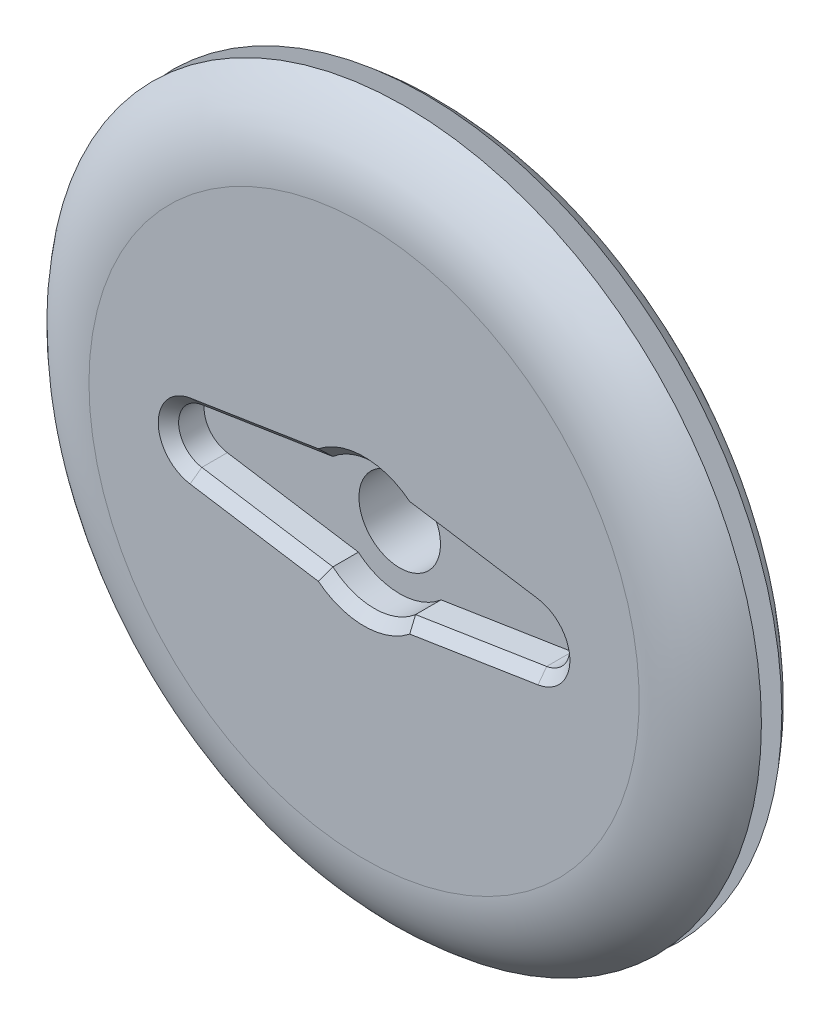
ISO-10303-21;
HEADER;
FILE_DESCRIPTION(('STEP AP214'),'2;1');
FILE_NAME('part.step','',(''),(''),'','','');
FILE_SCHEMA(('AUTOMOTIVE_DESIGN { 1 0 10303 214 1 1 1 1 }'));
ENDSEC;
DATA;
#1=APPLICATION_CONTEXT('core data for automotive mechanical design processes');
#2=APPLICATION_PROTOCOL_DEFINITION('international standard','automotive_design',2000,#1);
#3=PRODUCT_CONTEXT('',#1,'mechanical');
#4=PRODUCT('Part','Part','',(#3));
#5=PRODUCT_RELATED_PRODUCT_CATEGORY('part','',(#4));
#6=PRODUCT_DEFINITION_FORMATION('','',#4);
#7=PRODUCT_DEFINITION_CONTEXT('part definition',#1,'design');
#8=PRODUCT_DEFINITION('design','',#6,#7);
#9=PRODUCT_DEFINITION_SHAPE('','',#8);
#10=(LENGTH_UNIT() NAMED_UNIT(*) SI_UNIT(.MILLI.,.METRE.));
#11=(NAMED_UNIT(*) PLANE_ANGLE_UNIT() SI_UNIT($,.RADIAN.));
#12=(NAMED_UNIT(*) SI_UNIT($,.STERADIAN.) SOLID_ANGLE_UNIT());
#13=UNCERTAINTY_MEASURE_WITH_UNIT(LENGTH_MEASURE(1.E-05),#10,'distance_accuracy_value','');
#14=(GEOMETRIC_REPRESENTATION_CONTEXT(3) GLOBAL_UNCERTAINTY_ASSIGNED_CONTEXT((#13)) GLOBAL_UNIT_ASSIGNED_CONTEXT((#10,
#11,#12)) REPRESENTATION_CONTEXT('',''));
#15=CARTESIAN_POINT('',(0.,0.,0.));
#16=DIRECTION('',(0.,0.,1.));
#17=DIRECTION('',(1.,0.,0.));
#18=AXIS2_PLACEMENT_3D('',#15,#16,#17);
#19=CARTESIAN_POINT('',(0.,0.,-8.001));
#20=DIRECTION('',(0.,0.,1.));
#21=DIRECTION('',(1.,0.,0.));
#22=AXIS2_PLACEMENT_3D('',#19,#20,#21);
#23=CYLINDRICAL_SURFACE('',#22,4.);
#24=CARTESIAN_POINT('',(0.,0.,-8.));
#25=DIRECTION('',(0.,0.,1.));
#26=DIRECTION('',(1.,0.,0.));
#27=AXIS2_PLACEMENT_3D('',#24,#25,#26);
#28=CIRCLE('',#27,4.);
#29=CARTESIAN_POINT('',(4.,0.,-8.));
#30=VERTEX_POINT('',#29);
#31=EDGE_CURVE('E148',#30,#30,#28,.F.);
#32=ORIENTED_EDGE('',*,*,#31,.T.);
#33=EDGE_LOOP('',(#32));
#34=FACE_BOUND('',#33,.T.);
#35=CARTESIAN_POINT('',(0.,0.,-1.5));
#36=DIRECTION('',(0.,0.,1.));
#37=DIRECTION('',(1.,0.,0.));
#38=AXIS2_PLACEMENT_3D('',#35,#36,#37);
#39=CIRCLE('',#38,4.);
#40=CARTESIAN_POINT('',(4.,0.,-1.5));
#41=VERTEX_POINT('',#40);
#42=EDGE_CURVE('E56',#41,#41,#39,.F.);
#43=ORIENTED_EDGE('',*,*,#42,.F.);
#44=EDGE_LOOP('',(#43));
#45=FACE_BOUND('',#44,.T.);
#46=ADVANCED_FACE('F52',(#34,#45),#23,.F.);
#47=CARTESIAN_POINT('',(0.,0.,-2.));
#48=DIRECTION('',(0.,0.,-1.));
#49=DIRECTION('',(-1.,0.,0.));
#50=AXIS2_PLACEMENT_3D('',#47,#48,#49);
#51=PLANE('',#50);
#52=CARTESIAN_POINT('',(0.,0.,-2.));
#53=DIRECTION('',(0.,0.,-1.));
#54=DIRECTION('',(-1.,0.,0.));
#55=AXIS2_PLACEMENT_3D('',#52,#53,#54);
#56=CIRCLE('',#55,25.);
#57=CARTESIAN_POINT('',(-25.,0.,-2.));
#58=VERTEX_POINT('',#57);
#59=EDGE_CURVE('E210',#58,#58,#56,.T.);
#60=ORIENTED_EDGE('',*,*,#59,.F.);
#61=EDGE_LOOP('',(#60));
#62=FACE_BOUND('',#61,.T.);
#63=CARTESIAN_POINT('',(0.,0.,-2.));
#64=DIRECTION('',(0.,0.,-1.));
#65=DIRECTION('',(-1.,0.,0.));
#66=AXIS2_PLACEMENT_3D('',#63,#64,#65);
#67=CIRCLE('',#66,35.);
#68=CARTESIAN_POINT('',(-35.,0.,-2.));
#69=VERTEX_POINT('',#68);
#70=EDGE_CURVE('E211',#69,#69,#67,.T.);
#71=ORIENTED_EDGE('',*,*,#70,.T.);
#72=EDGE_LOOP('',(#71));
#73=FACE_BOUND('',#72,.T.);
#74=ADVANCED_FACE('F372',(#62,#73),#51,.T.);
#75=CARTESIAN_POINT('',(0.,0.,2.));
#76=DIRECTION('',(0.,0.,-1.));
#77=DIRECTION('',(-1.,0.,0.));
#78=AXIS2_PLACEMENT_3D('',#75,#76,#77);
#79=PLANE('',#78);
#80=CARTESIAN_POINT('',(16.5,0.,2.));
#81=DIRECTION('',(0.,0.,-1.));
#82=DIRECTION('',(-1.,0.,0.));
#83=AXIS2_PLACEMENT_3D('',#80,#81,#82);
#84=CIRCLE('',#83,3.70000000000002);
#85=CARTESIAN_POINT('',(17.0744090126528,3.65514080251136,2.));
#86=VERTEX_POINT('',#85);
#87=CARTESIAN_POINT('',(17.0744090126528,-3.65514080251136,2.));
#88=VERTEX_POINT('',#87);
#89=EDGE_CURVE('E232',#86,#88,#84,.T.);
#90=ORIENTED_EDGE('',*,*,#89,.T.);
#91=DIRECTION('',(-0.987875892570632,-0.155245679095352,0.));
#92=VECTOR('',#91,1.);
#93=CARTESIAN_POINT('',(0.972079157136123,-6.18563795527826,2.));
#94=LINE('',#93,#92);
#95=CARTESIAN_POINT('',(4.48327208773925,-5.63385049387171,2.));
#96=VERTEX_POINT('',#95);
#97=EDGE_CURVE('E240',#88,#96,#94,.T.);
#98=ORIENTED_EDGE('',*,*,#97,.T.);
#99=CARTESIAN_POINT('',(0.,0.,2.));
#100=DIRECTION('',(0.,0.,-1.));
#101=DIRECTION('',(-1.,0.,0.));
#102=AXIS2_PLACEMENT_3D('',#99,#100,#101);
#103=CIRCLE('',#102,7.20000000000003);
#104=CARTESIAN_POINT('',(-4.48327208773927,-5.63385049387169,2.));
#105=VERTEX_POINT('',#104);
#106=EDGE_CURVE('E235',#96,#105,#103,.T.);
#107=ORIENTED_EDGE('',*,*,#106,.T.);
#108=DIRECTION('',(-0.987875892570632,0.155245679095352,0.));
#109=VECTOR('',#108,1.);
#110=CARTESIAN_POINT('',(-0.972079157136121,-6.18563795527825,2.));
#111=LINE('',#110,#109);
#112=CARTESIAN_POINT('',(-17.0744090126528,-3.65514080251135,2.));
#113=VERTEX_POINT('',#112);
#114=EDGE_CURVE('E226',#105,#113,#111,.T.);
#115=ORIENTED_EDGE('',*,*,#114,.T.);
#116=CARTESIAN_POINT('',(-16.5,0.,2.));
#117=DIRECTION('',(0.,0.,-1.));
#118=DIRECTION('',(-1.,0.,0.));
#119=AXIS2_PLACEMENT_3D('',#116,#117,#118);
#120=CIRCLE('',#119,3.70000000000001);
#121=CARTESIAN_POINT('',(-17.0744090126528,3.65514080251135,2.));
#122=VERTEX_POINT('',#121);
#123=EDGE_CURVE('E228',#113,#122,#120,.T.);
#124=ORIENTED_EDGE('',*,*,#123,.T.);
#125=DIRECTION('',(0.987875892570632,0.155245679095352,0.));
#126=VECTOR('',#125,1.);
#127=CARTESIAN_POINT('',(-0.972079157136122,6.18563795527825,2.));
#128=LINE('',#127,#126);
#129=CARTESIAN_POINT('',(-4.48327208773924,5.6338504938717,2.));
#130=VERTEX_POINT('',#129);
#131=EDGE_CURVE('E224',#122,#130,#128,.T.);
#132=ORIENTED_EDGE('',*,*,#131,.T.);
#133=CARTESIAN_POINT('',(0.,0.,2.));
#134=DIRECTION('',(0.,0.,-1.));
#135=DIRECTION('',(-1.,0.,0.));
#136=AXIS2_PLACEMENT_3D('',#133,#134,#135);
#137=CIRCLE('',#136,7.20000000000003);
#138=CARTESIAN_POINT('',(4.48327208773922,5.63385049387171,2.));
#139=VERTEX_POINT('',#138);
#140=EDGE_CURVE('E225',#130,#139,#137,.T.);
#141=ORIENTED_EDGE('',*,*,#140,.T.);
#142=DIRECTION('',(0.987875892570632,-0.155245679095352,0.));
#143=VECTOR('',#142,1.);
#144=CARTESIAN_POINT('',(0.972079157136123,6.18563795527826,2.));
#145=LINE('',#144,#143);
#146=EDGE_CURVE('E229',#139,#86,#145,.T.);
#147=ORIENTED_EDGE('',*,*,#146,.T.);
#148=EDGE_LOOP('',(#90,#98,#107,#115,#124,#132,#141,#147));
#149=FACE_BOUND('',#148,.T.);
#150=CARTESIAN_POINT('',(0.,0.,2.));
#151=DIRECTION('',(0.,0.,-1.));
#152=DIRECTION('',(-1.,0.,0.));
#153=AXIS2_PLACEMENT_3D('',#150,#151,#152);
#154=CIRCLE('',#153,27.);
#155=CARTESIAN_POINT('',(-27.,0.,2.));
#156=VERTEX_POINT('',#155);
#157=EDGE_CURVE('E219',#156,#156,#154,.F.);
#158=ORIENTED_EDGE('',*,*,#157,.T.);
#159=EDGE_LOOP('',(#158));
#160=FACE_BOUND('',#159,.T.);
#161=ADVANCED_FACE('F355',(#149,#160),#79,.F.);
#162=CARTESIAN_POINT('',(0.,0.,-8.));
#163=DIRECTION('',(0.,0.,1.));
#164=DIRECTION('',(1.,0.,0.));
#165=AXIS2_PLACEMENT_3D('',#162,#163,#164);
#166=TOROIDAL_SURFACE('',#165,27.,10.);
#167=ORIENTED_EDGE('',*,*,#157,.F.);
#168=EDGE_LOOP('',(#167));
#169=FACE_BOUND('',#168,.T.);
#170=ORIENTED_EDGE('',*,*,#70,.F.);
#171=EDGE_LOOP('',(#170));
#172=FACE_BOUND('',#171,.T.);
#173=ADVANCED_FACE('F384',(#169,#172),#166,.T.);
#174=CARTESIAN_POINT('',(0.,0.,-4.));
#175=DIRECTION('',(0.,0.,1.));
#176=DIRECTION('',(1.,0.,0.));
#177=AXIS2_PLACEMENT_3D('',#174,#175,#176);
#178=CYLINDRICAL_SURFACE('',#177,25.);
#179=CARTESIAN_POINT('',(0.,0.,-4.));
#180=DIRECTION('',(0.,0.,-1.));
#181=DIRECTION('',(-1.,0.,0.));
#182=AXIS2_PLACEMENT_3D('',#179,#180,#181);
#183=CIRCLE('',#182,25.);
#184=CARTESIAN_POINT('',(-25.,0.,-4.));
#185=VERTEX_POINT('',#184);
#186=EDGE_CURVE('E206',#185,#185,#183,.T.);
#187=ORIENTED_EDGE('',*,*,#186,.F.);
#188=EDGE_LOOP('',(#187));
#189=FACE_BOUND('',#188,.T.);
#190=ORIENTED_EDGE('',*,*,#59,.T.);
#191=EDGE_LOOP('',(#190));
#192=FACE_BOUND('',#191,.T.);
#193=ADVANCED_FACE('F395',(#189,#192),#178,.T.);
#194=CARTESIAN_POINT('',(0.,0.,-4.));
#195=DIRECTION('',(0.,0.,1.));
#196=DIRECTION('',(-1.,0.,0.));
#197=AXIS2_PLACEMENT_3D('',#194,#195,#196);
#198=PLANE('',#197);
#199=ORIENTED_EDGE('',*,*,#186,.T.);
#200=EDGE_LOOP('',(#199));
#201=FACE_BOUND('',#200,.T.);
#202=CARTESIAN_POINT('',(0.,0.,-4.));
#203=DIRECTION('',(0.,0.,-1.));
#204=DIRECTION('',(-1.,0.,0.));
#205=AXIS2_PLACEMENT_3D('',#202,#203,#204);
#206=CIRCLE('',#205,35.);
#207=CARTESIAN_POINT('',(-35.,0.,-4.));
#208=VERTEX_POINT('',#207);
#209=EDGE_CURVE('E203',#208,#208,#206,.T.);
#210=ORIENTED_EDGE('',*,*,#209,.F.);
#211=EDGE_LOOP('',(#210));
#212=FACE_BOUND('',#211,.T.);
#213=ADVANCED_FACE('F397',(#201,#212),#198,.T.);
#214=CARTESIAN_POINT('',(0.,0.,-8.));
#215=DIRECTION('',(0.,0.,1.));
#216=DIRECTION('',(-1.,0.,0.));
#217=AXIS2_PLACEMENT_3D('',#214,#215,#216);
#218=PLANE('',#217);
#219=ORIENTED_EDGE('',*,*,#31,.F.);
#220=EDGE_LOOP('',(#219));
#221=FACE_BOUND('',#220,.T.);
#222=CARTESIAN_POINT('',(0.,0.,-8.));
#223=DIRECTION('',(0.,0.,-1.));
#224=DIRECTION('',(-1.,0.,0.));
#225=AXIS2_PLACEMENT_3D('',#222,#223,#224);
#226=CIRCLE('',#225,27.);
#227=CARTESIAN_POINT('',(-27.,0.,-8.));
#228=VERTEX_POINT('',#227);
#229=EDGE_CURVE('E205',#228,#228,#226,.F.);
#230=ORIENTED_EDGE('',*,*,#229,.F.);
#231=EDGE_LOOP('',(#230));
#232=FACE_BOUND('',#231,.T.);
#233=ADVANCED_FACE('F401',(#221,#232),#218,.F.);
#234=CARTESIAN_POINT('',(0.,0.,2.));
#235=DIRECTION('',(0.,0.,-1.));
#236=DIRECTION('',(1.,0.,0.));
#237=AXIS2_PLACEMENT_3D('',#234,#235,#236);
#238=TOROIDAL_SURFACE('',#237,27.,10.);
#239=ORIENTED_EDGE('',*,*,#229,.T.);
#240=EDGE_LOOP('',(#239));
#241=FACE_BOUND('',#240,.T.);
#242=ORIENTED_EDGE('',*,*,#209,.T.);
#243=EDGE_LOOP('',(#242));
#244=FACE_BOUND('',#243,.T.);
#245=ADVANCED_FACE('F396',(#241,#244),#238,.T.);
#246=CARTESIAN_POINT('',(-4.05671289075597,4.68861179049559,-40.3524472615974));
#247=DIRECTION('',(-0.155245679095352,0.987875892570632,0.));
#248=DIRECTION('',(-0.987875892570632,-0.155245679095352,0.));
#249=AXIS2_PLACEMENT_3D('',#246,#247,#248);
#250=PLANE('',#249);
#251=DIRECTION('',(0.,0.,1.));
#252=VECTOR('',#251,1.);
#253=CARTESIAN_POINT('',(-4.05671289075597,4.68861179049559,-40.3524472615974));
#254=LINE('',#253,#252);
#255=CARTESIAN_POINT('',(-4.05671289075597,4.6886117904956,-1.5));
#256=VERTEX_POINT('',#255);
#257=CARTESIAN_POINT('',(-4.05671289075597,4.68861179049559,1.));
#258=VERTEX_POINT('',#257);
#259=EDGE_CURVE('E145',#256,#258,#254,.T.);
#260=ORIENTED_EDGE('',*,*,#259,.T.);
#261=DIRECTION('',(-0.987875892570632,-0.155245679095352,0.));
#262=VECTOR('',#261,1.);
#263=CARTESIAN_POINT('',(-4.05671289075597,4.68861179049559,1.));
#264=LINE('',#263,#262);
#265=CARTESIAN_POINT('',(-16.9191633335575,2.66726490994071,1.));
#266=VERTEX_POINT('',#265);
#267=EDGE_CURVE('E12',#258,#266,#264,.T.);
#268=ORIENTED_EDGE('',*,*,#267,.T.);
#269=DIRECTION('',(0.,0.,1.));
#270=VECTOR('',#269,1.);
#271=CARTESIAN_POINT('',(-16.9191633335575,2.66726490994071,-40.3524472615974));
#272=LINE('',#271,#270);
#273=CARTESIAN_POINT('',(-16.9191633335575,2.66726490994071,-1.5));
#274=VERTEX_POINT('',#273);
#275=EDGE_CURVE('E152',#274,#266,#272,.T.);
#276=ORIENTED_EDGE('',*,*,#275,.F.);
#277=DIRECTION('',(-0.987875892570632,-0.155245679095352,0.));
#278=VECTOR('',#277,1.);
#279=CARTESIAN_POINT('',(-4.05671289075597,4.6886117904956,-1.5));
#280=LINE('',#279,#278);
#281=EDGE_CURVE('E155',#256,#274,#280,.T.);
#282=ORIENTED_EDGE('',*,*,#281,.F.);
#283=EDGE_LOOP('',(#260,#268,#276,#282));
#284=FACE_BOUND('',#283,.T.);
#285=ADVANCED_FACE('F153',(#284),#250,.F.);
#286=CARTESIAN_POINT('',(-16.5,0.,-40.3524472615974));
#287=DIRECTION('',(0.,0.,1.));
#288=DIRECTION('',(1.,0.,0.));
#289=AXIS2_PLACEMENT_3D('',#286,#287,#288);
#290=CYLINDRICAL_SURFACE('',#289,2.7);
#291=ORIENTED_EDGE('',*,*,#275,.T.);
#292=CARTESIAN_POINT('',(-16.5,0.,1.));
#293=DIRECTION('',(0.,0.,-1.));
#294=DIRECTION('',(-1.,0.,0.));
#295=AXIS2_PLACEMENT_3D('',#292,#293,#294);
#296=CIRCLE('',#295,2.7);
#297=CARTESIAN_POINT('',(-16.9191633335574,-2.66726490994071,1.));
#298=VERTEX_POINT('',#297);
#299=EDGE_CURVE('E250',#266,#298,#296,.F.);
#300=ORIENTED_EDGE('',*,*,#299,.T.);
#301=DIRECTION('',(0.,0.,1.));
#302=VECTOR('',#301,1.);
#303=CARTESIAN_POINT('',(-16.9191633335574,-2.66726490994071,-40.3524472615974));
#304=LINE('',#303,#302);
#305=CARTESIAN_POINT('',(-16.9191633335574,-2.66726490994071,-1.5));
#306=VERTEX_POINT('',#305);
#307=EDGE_CURVE('E193',#306,#298,#304,.T.);
#308=ORIENTED_EDGE('',*,*,#307,.F.);
#309=CARTESIAN_POINT('',(-16.5,0.,-1.5));
#310=DIRECTION('',(0.,0.,1.));
#311=DIRECTION('',(1.,0.,0.));
#312=AXIS2_PLACEMENT_3D('',#309,#310,#311);
#313=CIRCLE('',#312,2.7);
#314=EDGE_CURVE('E160',#274,#306,#313,.T.);
#315=ORIENTED_EDGE('',*,*,#314,.F.);
#316=EDGE_LOOP('',(#291,#300,#308,#315));
#317=FACE_BOUND('',#316,.T.);
#318=ADVANCED_FACE('F442',(#317),#290,.F.);
#319=CARTESIAN_POINT('',(-16.9191633335574,-2.66726490994071,-40.3524472615974));
#320=DIRECTION('',(-0.155245679095352,-0.987875892570632,0.));
#321=DIRECTION('',(0.987875892570632,-0.155245679095352,0.));
#322=AXIS2_PLACEMENT_3D('',#319,#320,#321);
#323=PLANE('',#322);
#324=ORIENTED_EDGE('',*,*,#307,.T.);
#325=DIRECTION('',(0.987875892570632,-0.155245679095352,0.));
#326=VECTOR('',#325,1.);
#327=CARTESIAN_POINT('',(-16.9191633335574,-2.66726490994071,1.));
#328=LINE('',#327,#326);
#329=CARTESIAN_POINT('',(-4.05671289075597,-4.68861179049559,1.));
#330=VERTEX_POINT('',#329);
#331=EDGE_CURVE('E244',#298,#330,#328,.T.);
#332=ORIENTED_EDGE('',*,*,#331,.T.);
#333=DIRECTION('',(0.,0.,1.));
#334=VECTOR('',#333,1.);
#335=CARTESIAN_POINT('',(-4.05671289075597,-4.68861179049559,-40.3524472615974));
#336=LINE('',#335,#334);
#337=CARTESIAN_POINT('',(-4.05671289075597,-4.68861179049559,-1.5));
#338=VERTEX_POINT('',#337);
#339=EDGE_CURVE('E191',#338,#330,#336,.T.);
#340=ORIENTED_EDGE('',*,*,#339,.F.);
#341=DIRECTION('',(0.987875892570632,-0.155245679095352,0.));
#342=VECTOR('',#341,1.);
#343=CARTESIAN_POINT('',(-16.9191633335574,-2.66726490994071,-1.5));
#344=LINE('',#343,#342);
#345=EDGE_CURVE('E169',#306,#338,#344,.T.);
#346=ORIENTED_EDGE('',*,*,#345,.F.);
#347=EDGE_LOOP('',(#324,#332,#340,#346));
#348=FACE_BOUND('',#347,.T.);
#349=ADVANCED_FACE('F366',(#348),#323,.F.);
#350=CARTESIAN_POINT('',(0.,0.,-40.3524472615974));
#351=DIRECTION('',(0.,0.,1.));
#352=DIRECTION('',(1.,0.,0.));
#353=AXIS2_PLACEMENT_3D('',#350,#351,#352);
#354=CYLINDRICAL_SURFACE('',#353,6.2);
#355=ORIENTED_EDGE('',*,*,#339,.T.);
#356=CARTESIAN_POINT('',(0.,0.,0.99999999999998));
#357=DIRECTION('',(0.,0.,-1.));
#358=DIRECTION('',(-1.,0.,0.));
#359=AXIS2_PLACEMENT_3D('',#356,#357,#358);
#360=CIRCLE('',#359,6.2);
#361=CARTESIAN_POINT('',(4.05671289075597,-4.68861179049559,0.99999999999998));
#362=VERTEX_POINT('',#361);
#363=EDGE_CURVE('E218',#330,#362,#360,.F.);
#364=ORIENTED_EDGE('',*,*,#363,.T.);
#365=DIRECTION('',(0.,0.,1.));
#366=VECTOR('',#365,1.);
#367=CARTESIAN_POINT('',(4.05671289075597,-4.68861179049559,-40.3524472615974));
#368=LINE('',#367,#366);
#369=CARTESIAN_POINT('',(4.05671289075597,-4.6886117904956,-1.5));
#370=VERTEX_POINT('',#369);
#371=EDGE_CURVE('E189',#370,#362,#368,.T.);
#372=ORIENTED_EDGE('',*,*,#371,.F.);
#373=CARTESIAN_POINT('',(0.,0.,-1.5));
#374=DIRECTION('',(0.,0.,1.));
#375=DIRECTION('',(1.,0.,0.));
#376=AXIS2_PLACEMENT_3D('',#373,#374,#375);
#377=CIRCLE('',#376,6.2);
#378=EDGE_CURVE('E175',#338,#370,#377,.T.);
#379=ORIENTED_EDGE('',*,*,#378,.F.);
#380=EDGE_LOOP('',(#355,#364,#372,#379));
#381=FACE_BOUND('',#380,.T.);
#382=ADVANCED_FACE('F360',(#381),#354,.F.);
#383=CARTESIAN_POINT('',(4.05671289075597,-4.68861179049559,-40.3524472615974));
#384=DIRECTION('',(0.155245679095352,-0.987875892570632,0.));
#385=DIRECTION('',(0.987875892570632,0.155245679095352,0.));
#386=AXIS2_PLACEMENT_3D('',#383,#384,#385);
#387=PLANE('',#386);
#388=ORIENTED_EDGE('',*,*,#371,.T.);
#389=DIRECTION('',(0.987875892570632,0.155245679095352,0.));
#390=VECTOR('',#389,1.);
#391=CARTESIAN_POINT('',(4.05671289075597,-4.68861179049559,0.99999999999998));
#392=LINE('',#391,#390);
#393=CARTESIAN_POINT('',(16.9191633335574,-2.66726490994071,0.99999999999998));
#394=VERTEX_POINT('',#393);
#395=EDGE_CURVE('E237',#362,#394,#392,.T.);
#396=ORIENTED_EDGE('',*,*,#395,.T.);
#397=DIRECTION('',(0.,0.,1.));
#398=VECTOR('',#397,1.);
#399=CARTESIAN_POINT('',(16.9191633335574,-2.66726490994071,-40.3524472615974));
#400=LINE('',#399,#398);
#401=CARTESIAN_POINT('',(16.9191633335574,-2.66726490994071,-1.5));
#402=VERTEX_POINT('',#401);
#403=EDGE_CURVE('E184',#402,#394,#400,.T.);
#404=ORIENTED_EDGE('',*,*,#403,.F.);
#405=DIRECTION('',(0.987875892570632,0.155245679095352,0.));
#406=VECTOR('',#405,1.);
#407=CARTESIAN_POINT('',(4.05671289075597,-4.6886117904956,-1.5));
#408=LINE('',#407,#406);
#409=EDGE_CURVE('E174',#370,#402,#408,.T.);
#410=ORIENTED_EDGE('',*,*,#409,.F.);
#411=EDGE_LOOP('',(#388,#396,#404,#410));
#412=FACE_BOUND('',#411,.T.);
#413=ADVANCED_FACE('F365',(#412),#387,.F.);
#414=CARTESIAN_POINT('',(16.5,0.,-40.3524472615974));
#415=DIRECTION('',(0.,0.,1.));
#416=DIRECTION('',(1.,0.,0.));
#417=AXIS2_PLACEMENT_3D('',#414,#415,#416);
#418=CYLINDRICAL_SURFACE('',#417,2.7);
#419=ORIENTED_EDGE('',*,*,#403,.T.);
#420=CARTESIAN_POINT('',(16.5,0.,0.99999999999998));
#421=DIRECTION('',(0.,0.,-1.));
#422=DIRECTION('',(-1.,0.,0.));
#423=AXIS2_PLACEMENT_3D('',#420,#421,#422);
#424=CIRCLE('',#423,2.7);
#425=CARTESIAN_POINT('',(16.9191633335575,2.66726490994071,0.99999999999998));
#426=VERTEX_POINT('',#425);
#427=EDGE_CURVE('E243',#394,#426,#424,.F.);
#428=ORIENTED_EDGE('',*,*,#427,.T.);
#429=DIRECTION('',(0.,0.,1.));
#430=VECTOR('',#429,1.);
#431=CARTESIAN_POINT('',(16.9191633335575,2.66726490994071,-40.3524472615974));
#432=LINE('',#431,#430);
#433=CARTESIAN_POINT('',(16.9191633335575,2.66726490994071,-1.5));
#434=VERTEX_POINT('',#433);
#435=EDGE_CURVE('E185',#434,#426,#432,.T.);
#436=ORIENTED_EDGE('',*,*,#435,.F.);
#437=CARTESIAN_POINT('',(16.5,0.,-1.5));
#438=DIRECTION('',(0.,0.,1.));
#439=DIRECTION('',(1.,0.,0.));
#440=AXIS2_PLACEMENT_3D('',#437,#438,#439);
#441=CIRCLE('',#440,2.7);
#442=EDGE_CURVE('E178',#402,#434,#441,.T.);
#443=ORIENTED_EDGE('',*,*,#442,.F.);
#444=EDGE_LOOP('',(#419,#428,#436,#443));
#445=FACE_BOUND('',#444,.T.);
#446=ADVANCED_FACE('F485',(#445),#418,.F.);
#447=CARTESIAN_POINT('',(16.9191633335575,2.66726490994071,-40.3524472615974));
#448=DIRECTION('',(0.155245679095352,0.987875892570632,0.));
#449=DIRECTION('',(-0.987875892570632,0.155245679095352,0.));
#450=AXIS2_PLACEMENT_3D('',#447,#448,#449);
#451=PLANE('',#450);
#452=ORIENTED_EDGE('',*,*,#435,.T.);
#453=DIRECTION('',(-0.987875892570632,0.155245679095352,0.));
#454=VECTOR('',#453,1.);
#455=CARTESIAN_POINT('',(16.9191633335575,2.66726490994071,0.99999999999998));
#456=LINE('',#455,#454);
#457=CARTESIAN_POINT('',(4.05671289075597,4.68861179049559,1.));
#458=VERTEX_POINT('',#457);
#459=EDGE_CURVE('E241',#426,#458,#456,.T.);
#460=ORIENTED_EDGE('',*,*,#459,.T.);
#461=DIRECTION('',(0.,0.,1.));
#462=VECTOR('',#461,1.);
#463=CARTESIAN_POINT('',(4.05671289075597,4.68861179049559,-40.3524472615974));
#464=LINE('',#463,#462);
#465=CARTESIAN_POINT('',(4.05671289075598,4.68861179049559,-1.5));
#466=VERTEX_POINT('',#465);
#467=EDGE_CURVE('E149',#466,#458,#464,.T.);
#468=ORIENTED_EDGE('',*,*,#467,.F.);
#469=DIRECTION('',(-0.987875892570632,0.155245679095352,0.));
#470=VECTOR('',#469,1.);
#471=CARTESIAN_POINT('',(16.9191633335575,2.66726490994071,-1.5));
#472=LINE('',#471,#470);
#473=EDGE_CURVE('E164',#434,#466,#472,.T.);
#474=ORIENTED_EDGE('',*,*,#473,.F.);
#475=EDGE_LOOP('',(#452,#460,#468,#474));
#476=FACE_BOUND('',#475,.T.);
#477=ADVANCED_FACE('F492',(#476),#451,.F.);
#478=CARTESIAN_POINT('',(0.,0.,-40.3524472615974));
#479=DIRECTION('',(0.,0.,1.));
#480=DIRECTION('',(1.,0.,0.));
#481=AXIS2_PLACEMENT_3D('',#478,#479,#480);
#482=CYLINDRICAL_SURFACE('',#481,6.20000000000002);
#483=ORIENTED_EDGE('',*,*,#467,.T.);
#484=CARTESIAN_POINT('',(0.,0.,1.));
#485=DIRECTION('',(0.,0.,-1.));
#486=DIRECTION('',(-1.,0.,0.));
#487=AXIS2_PLACEMENT_3D('',#484,#485,#486);
#488=CIRCLE('',#487,6.20000000000002);
#489=EDGE_CURVE('E63',#458,#258,#488,.F.);
#490=ORIENTED_EDGE('',*,*,#489,.T.);
#491=ORIENTED_EDGE('',*,*,#259,.F.);
#492=CARTESIAN_POINT('',(0.,0.,-1.5));
#493=DIRECTION('',(0.,0.,1.));
#494=DIRECTION('',(1.,0.,0.));
#495=AXIS2_PLACEMENT_3D('',#492,#493,#494);
#496=CIRCLE('',#495,6.20000000000002);
#497=EDGE_CURVE('E146',#466,#256,#496,.T.);
#498=ORIENTED_EDGE('',*,*,#497,.F.);
#499=EDGE_LOOP('',(#483,#490,#491,#498));
#500=FACE_BOUND('',#499,.T.);
#501=ADVANCED_FACE('F144',(#500),#482,.F.);
#502=CARTESIAN_POINT('',(0.,0.,1.));
#503=DIRECTION('',(0.,0.,1.));
#504=DIRECTION('',(1.,0.,0.));
#505=AXIS2_PLACEMENT_3D('',#502,#503,#504);
#506=CONICAL_SURFACE('',#505,6.20000000000002,0.785398163397453);
#507=CARTESIAN_POINT('',(4.05671289075597,4.68861179049559,1.));
#508=CARTESIAN_POINT('',(4.12951895435172,4.84563624660806,1.16642350152269));
#509=CARTESIAN_POINT('',(4.20146862250485,5.00291845000579,1.33296867368281));
#510=CARTESIAN_POINT('',(4.34365501788445,5.31799801888577,1.66630200752971));
#511=CARTESIAN_POINT('',(4.41389174872573,5.47579538328008,1.83309016870293));
#512=CARTESIAN_POINT('',(4.48327208773922,5.63385049387171,2.));
#513=B_SPLINE_CURVE_WITH_KNOTS('',3,(#507,#508,#509,#510,#511,#512),.UNSPECIFIED.,.F.,.F.,(4,2,
4),(0.,0.720323306304535,1.44064509237618),.UNSPECIFIED.);
#514=EDGE_CURVE('E311',#139,#458,#513,.F.);
#515=ORIENTED_EDGE('',*,*,#514,.F.);
#516=ORIENTED_EDGE('',*,*,#140,.F.);
#517=CARTESIAN_POINT('',(-4.05671289075597,4.68861179049559,1.));
#518=CARTESIAN_POINT('',(-4.12951895435174,4.84563624660805,1.16642350152269));
#519=CARTESIAN_POINT('',(-4.20146862250487,5.00291845000577,1.33296867368281));
#520=CARTESIAN_POINT('',(-4.34365501788447,5.31799801888575,1.66630200752971));
#521=CARTESIAN_POINT('',(-4.41389174872576,5.47579538328006,1.83309016870293));
#522=CARTESIAN_POINT('',(-4.48327208773924,5.6338504938717,2.));
#523=B_SPLINE_CURVE_WITH_KNOTS('',3,(#517,#518,#519,#520,#521,#522),.UNSPECIFIED.,.F.,.F.,(4,2,
4),(0.,0.720323306304533,1.44064509237617),.UNSPECIFIED.);
#524=EDGE_CURVE('E196',#258,#130,#523,.T.);
#525=ORIENTED_EDGE('',*,*,#524,.F.);
#526=ORIENTED_EDGE('',*,*,#489,.F.);
#527=EDGE_LOOP('',(#515,#516,#525,#526));
#528=FACE_BOUND('',#527,.T.);
#529=ADVANCED_FACE('F301',(#528),#506,.F.);
#530=CARTESIAN_POINT('',(-4.05671289075597,4.68861179049559,1.));
#531=DIRECTION('',(-0.109775272438233,0.698533742607404,-0.707106781186551));
#532=DIRECTION('',(-0.987875892570632,-0.155245679095352,0.));
#533=AXIS2_PLACEMENT_3D('',#530,#531,#532);
#534=PLANE('',#533);
#535=ORIENTED_EDGE('',*,*,#524,.T.);
#536=ORIENTED_EDGE('',*,*,#131,.F.);
#537=DIRECTION('',(-0.109775272438235,0.698533742607411,0.707106781186544));
#538=VECTOR('',#537,1.);
#539=CARTESIAN_POINT('',(-16.9191633335575,2.66726490994071,1.));
#540=LINE('',#539,#538);
#541=EDGE_CURVE('E324',#266,#122,#540,.T.);
#542=ORIENTED_EDGE('',*,*,#541,.F.);
#543=ORIENTED_EDGE('',*,*,#267,.F.);
#544=EDGE_LOOP('',(#535,#536,#542,#543));
#545=FACE_BOUND('',#544,.T.);
#546=ADVANCED_FACE('F57',(#545),#534,.F.);
#547=CARTESIAN_POINT('',(16.9191633335575,2.66726490994071,0.99999999999998));
#548=DIRECTION('',(0.109775272438234,0.698533742607407,-0.707106781186548));
#549=DIRECTION('',(-0.987875892570632,0.155245679095352,0.));
#550=AXIS2_PLACEMENT_3D('',#547,#548,#549);
#551=PLANE('',#550);
#552=ORIENTED_EDGE('',*,*,#514,.T.);
#553=ORIENTED_EDGE('',*,*,#459,.F.);
#554=DIRECTION('',(-0.109775272438234,-0.698533742607408,-0.707106781186547));
#555=VECTOR('',#554,1.);
#556=CARTESIAN_POINT('',(17.0744090126528,3.65514080251136,2.));
#557=LINE('',#556,#555);
#558=EDGE_CURVE('E333',#86,#426,#557,.T.);
#559=ORIENTED_EDGE('',*,*,#558,.F.);
#560=ORIENTED_EDGE('',*,*,#146,.F.);
#561=EDGE_LOOP('',(#552,#553,#559,#560));
#562=FACE_BOUND('',#561,.T.);
#563=ADVANCED_FACE('F299',(#562),#551,.F.);
#564=CARTESIAN_POINT('',(-16.5,0.,1.));
#565=DIRECTION('',(0.,0.,1.));
#566=DIRECTION('',(1.,0.,0.));
#567=AXIS2_PLACEMENT_3D('',#564,#565,#566);
#568=CONICAL_SURFACE('',#567,2.7,0.785398163397452);
#569=ORIENTED_EDGE('',*,*,#541,.T.);
#570=ORIENTED_EDGE('',*,*,#123,.F.);
#571=DIRECTION('',(-0.109775272438236,-0.69853374260741,0.707106781186545));
#572=VECTOR('',#571,1.);
#573=CARTESIAN_POINT('',(-16.9191633335574,-2.66726490994071,1.));
#574=LINE('',#573,#572);
#575=EDGE_CURVE('E337',#298,#113,#574,.T.);
#576=ORIENTED_EDGE('',*,*,#575,.F.);
#577=ORIENTED_EDGE('',*,*,#299,.F.);
#578=EDGE_LOOP('',(#569,#570,#576,#577));
#579=FACE_BOUND('',#578,.T.);
#580=ADVANCED_FACE('F292',(#579),#568,.F.);
#581=CARTESIAN_POINT('',(16.5,0.,0.99999999999998));
#582=DIRECTION('',(0.,0.,1.));
#583=DIRECTION('',(1.,0.,0.));
#584=AXIS2_PLACEMENT_3D('',#581,#582,#583);
#585=CONICAL_SURFACE('',#584,2.7,0.785398163397448);
#586=ORIENTED_EDGE('',*,*,#558,.T.);
#587=ORIENTED_EDGE('',*,*,#427,.F.);
#588=DIRECTION('',(-0.109775272438234,0.698533742607407,-0.707106781186548));
#589=VECTOR('',#588,1.);
#590=CARTESIAN_POINT('',(17.0744090126528,-3.65514080251136,2.));
#591=LINE('',#590,#589);
#592=EDGE_CURVE('E338',#88,#394,#591,.T.);
#593=ORIENTED_EDGE('',*,*,#592,.F.);
#594=ORIENTED_EDGE('',*,*,#89,.F.);
#595=EDGE_LOOP('',(#586,#587,#593,#594));
#596=FACE_BOUND('',#595,.T.);
#597=ADVANCED_FACE('F282',(#596),#585,.F.);
#598=CARTESIAN_POINT('',(-16.9191633335574,-2.66726490994071,1.));
#599=DIRECTION('',(-0.109775272438233,-0.698533742607404,-0.707106781186551));
#600=DIRECTION('',(0.987875892570632,-0.155245679095352,0.));
#601=AXIS2_PLACEMENT_3D('',#598,#599,#600);
#602=PLANE('',#601);
#603=ORIENTED_EDGE('',*,*,#575,.T.);
#604=ORIENTED_EDGE('',*,*,#114,.F.);
#605=CARTESIAN_POINT('',(-4.48327208773927,-5.63385049387169,2.));
#606=CARTESIAN_POINT('',(-4.41389174872579,-5.47579538328006,1.83309016870293));
#607=CARTESIAN_POINT('',(-4.34365501788451,-5.31799801888574,1.66630200752971));
#608=CARTESIAN_POINT('',(-4.20146862250491,-5.00291845000576,1.33296867368281));
#609=CARTESIAN_POINT('',(-4.12951895435177,-4.84563624660804,1.16642350152269));
#610=CARTESIAN_POINT('',(-4.05671289075601,-4.68861179049558,0.999999999999995));
#611=B_SPLINE_CURVE_WITH_KNOTS('',3,(#605,#606,#607,#608,#609,#610),.UNSPECIFIED.,.F.,.F.,(4,2,
4),(0.,0.720321786071644,1.44064509237618),.UNSPECIFIED.);
#612=EDGE_CURVE('E257',#330,#105,#611,.F.);
#613=ORIENTED_EDGE('',*,*,#612,.F.);
#614=ORIENTED_EDGE('',*,*,#331,.F.);
#615=EDGE_LOOP('',(#603,#604,#613,#614));
#616=FACE_BOUND('',#615,.T.);
#617=ADVANCED_FACE('F280',(#616),#602,.F.);
#618=CARTESIAN_POINT('',(4.05671289075597,-4.68861179049559,0.99999999999998));
#619=DIRECTION('',(0.109775272438234,-0.698533742607407,-0.707106781186548));
#620=DIRECTION('',(0.987875892570632,0.155245679095352,0.));
#621=AXIS2_PLACEMENT_3D('',#618,#619,#620);
#622=PLANE('',#621);
#623=ORIENTED_EDGE('',*,*,#592,.T.);
#624=ORIENTED_EDGE('',*,*,#395,.F.);
#625=CARTESIAN_POINT('',(4.05671289075597,-4.68861179049559,0.99999999999998));
#626=CARTESIAN_POINT('',(4.12951895435174,-4.84563624660805,1.16642350152268));
#627=CARTESIAN_POINT('',(4.20146862250487,-5.00291845000578,1.3329686736828));
#628=CARTESIAN_POINT('',(4.34365501788448,-5.31799801888576,1.66630200752971));
#629=CARTESIAN_POINT('',(4.41389174872577,-5.47579538328007,1.83309016870292));
#630=CARTESIAN_POINT('',(4.48327208773925,-5.63385049387171,2.));
#631=B_SPLINE_CURVE_WITH_KNOTS('',3,(#625,#626,#627,#628,#629,#630),.UNSPECIFIED.,.F.,.F.,(4,2,
4),(0.,0.720323306304545,1.4406450923762),.UNSPECIFIED.);
#632=EDGE_CURVE('E249',#96,#362,#631,.F.);
#633=ORIENTED_EDGE('',*,*,#632,.F.);
#634=ORIENTED_EDGE('',*,*,#97,.F.);
#635=EDGE_LOOP('',(#623,#624,#633,#634));
#636=FACE_BOUND('',#635,.T.);
#637=ADVANCED_FACE('F268',(#636),#622,.F.);
#638=CARTESIAN_POINT('',(0.,0.,0.99999999999998));
#639=DIRECTION('',(0.,0.,1.));
#640=DIRECTION('',(1.,0.,0.));
#641=AXIS2_PLACEMENT_3D('',#638,#639,#640);
#642=CONICAL_SURFACE('',#641,6.2,0.785398163397449);
#643=ORIENTED_EDGE('',*,*,#612,.T.);
#644=ORIENTED_EDGE('',*,*,#106,.F.);
#645=ORIENTED_EDGE('',*,*,#632,.T.);
#646=ORIENTED_EDGE('',*,*,#363,.F.);
#647=EDGE_LOOP('',(#643,#644,#645,#646));
#648=FACE_BOUND('',#647,.T.);
#649=ADVANCED_FACE('F266',(#648),#642,.F.);
#650=CARTESIAN_POINT('',(0.,0.,-1.5));
#651=DIRECTION('',(0.,0.,1.));
#652=DIRECTION('',(1.,0.,0.));
#653=AXIS2_PLACEMENT_3D('',#650,#651,#652);
#654=PLANE('',#653);
#655=ORIENTED_EDGE('',*,*,#497,.T.);
#656=ORIENTED_EDGE('',*,*,#281,.T.);
#657=ORIENTED_EDGE('',*,*,#314,.T.);
#658=ORIENTED_EDGE('',*,*,#345,.T.);
#659=ORIENTED_EDGE('',*,*,#378,.T.);
#660=ORIENTED_EDGE('',*,*,#409,.T.);
#661=ORIENTED_EDGE('',*,*,#442,.T.);
#662=ORIENTED_EDGE('',*,*,#473,.T.);
#663=EDGE_LOOP('',(#655,#656,#657,#658,#659,#660,#661,#662));
#664=FACE_BOUND('',#663,.T.);
#665=ORIENTED_EDGE('',*,*,#42,.T.);
#666=EDGE_LOOP('',(#665));
#667=FACE_BOUND('',#666,.T.);
#668=ADVANCED_FACE('F163',(#664,#667),#654,.T.);
#669=CLOSED_SHELL('',(#46,#74,#161,#173,#193,#213,#233,#245,#285,#318,#349,#382,#413,#446,#477,
#501,#529,#546,#563,#580,#597,#617,#637,#649,#668));
#670=MANIFOLD_SOLID_BREP('B2',#669);
#671=ADVANCED_BREP_SHAPE_REPRESENTATION('',(#18,#670),#14);
#672=SHAPE_DEFINITION_REPRESENTATION(#9,#671);
ENDSEC;
END-ISO-10303-21;
